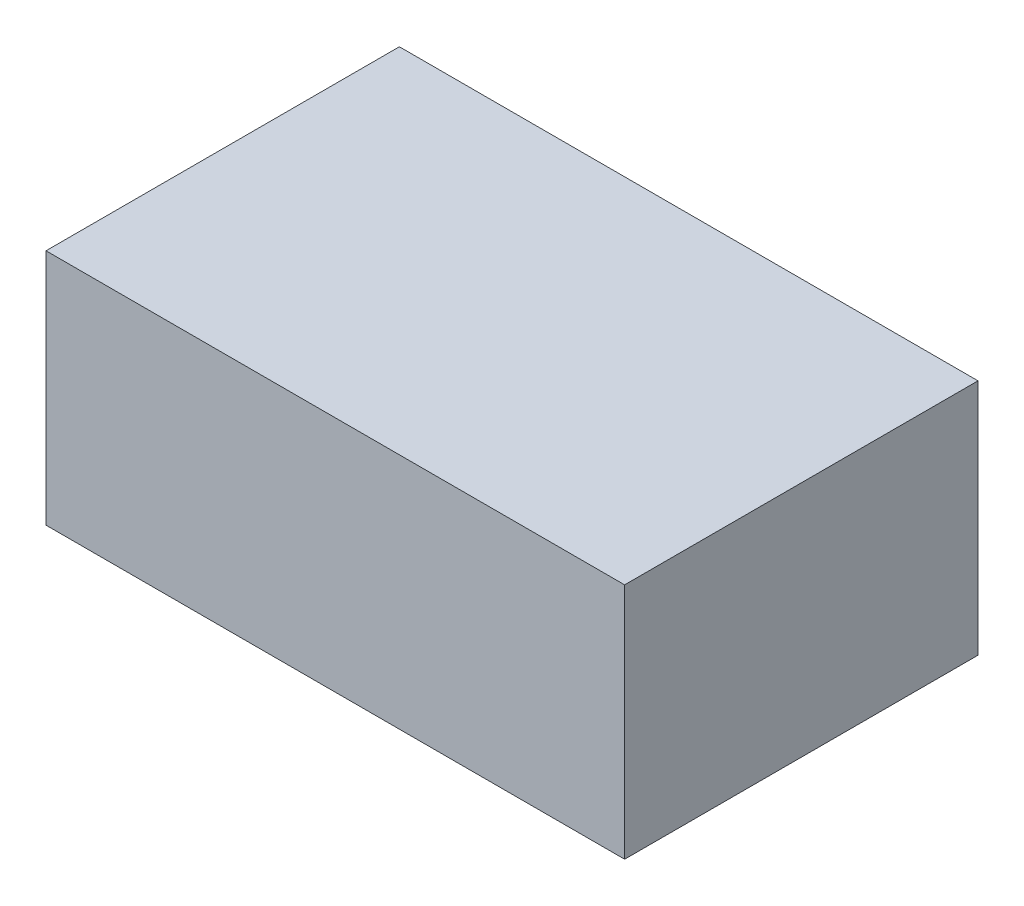
ISO-10303-21;
HEADER;
FILE_DESCRIPTION(('STEP AP214'),'2;1');
FILE_NAME('part.step','',(''),(''),'','','');
FILE_SCHEMA(('AUTOMOTIVE_DESIGN { 1 0 10303 214 1 1 1 1 }'));
ENDSEC;
DATA;
#1=APPLICATION_CONTEXT('core data for automotive mechanical design processes');
#2=APPLICATION_PROTOCOL_DEFINITION('international standard','automotive_design',2000,#1);
#3=PRODUCT_CONTEXT('',#1,'mechanical');
#4=PRODUCT('Part','Part','',(#3));
#5=PRODUCT_RELATED_PRODUCT_CATEGORY('part','',(#4));
#6=PRODUCT_DEFINITION_FORMATION('','',#4);
#7=PRODUCT_DEFINITION_CONTEXT('part definition',#1,'design');
#8=PRODUCT_DEFINITION('design','',#6,#7);
#9=PRODUCT_DEFINITION_SHAPE('','',#8);
#10=(LENGTH_UNIT() NAMED_UNIT(*) SI_UNIT(.MILLI.,.METRE.));
#11=(NAMED_UNIT(*) PLANE_ANGLE_UNIT() SI_UNIT($,.RADIAN.));
#12=(NAMED_UNIT(*) SI_UNIT($,.STERADIAN.) SOLID_ANGLE_UNIT());
#13=UNCERTAINTY_MEASURE_WITH_UNIT(LENGTH_MEASURE(1.E-05),#10,'distance_accuracy_value','');
#14=(GEOMETRIC_REPRESENTATION_CONTEXT(3) GLOBAL_UNCERTAINTY_ASSIGNED_CONTEXT((#13)) GLOBAL_UNIT_ASSIGNED_CONTEXT((#10,
#11,#12)) REPRESENTATION_CONTEXT('',''));
#15=CARTESIAN_POINT('',(0.,0.,0.));
#16=DIRECTION('',(0.,0.,1.));
#17=DIRECTION('',(1.,0.,0.));
#18=AXIS2_PLACEMENT_3D('',#15,#16,#17);
#19=CARTESIAN_POINT('',(-0.05,0.22,-1.89478486941322));
#20=DIRECTION('',(0.,1.,0.));
#21=DIRECTION('',(-1.,0.,0.));
#22=AXIS2_PLACEMENT_3D('',#19,#20,#21);
#23=PLANE('',#22);
#24=DIRECTION('',(1.,0.,0.));
#25=VECTOR('',#24,1.);
#26=CARTESIAN_POINT('',(-0.05,0.22,-0.684));
#27=LINE('',#26,#25);
#28=CARTESIAN_POINT('',(-1.17,0.22,-0.684));
#29=VERTEX_POINT('',#28);
#30=CARTESIAN_POINT('',(-0.05,0.22,-0.684));
#31=VERTEX_POINT('',#30);
#32=EDGE_CURVE('E96',#29,#31,#27,.T.);
#33=ORIENTED_EDGE('',*,*,#32,.F.);
#34=DIRECTION('',(0.,0.,1.));
#35=VECTOR('',#34,1.);
#36=CARTESIAN_POINT('',(-1.17,0.22,-1.89478486941322));
#37=LINE('',#36,#35);
#38=CARTESIAN_POINT('',(-1.17,0.22,0.));
#39=VERTEX_POINT('',#38);
#40=EDGE_CURVE('E37',#29,#39,#37,.T.);
#41=ORIENTED_EDGE('',*,*,#40,.T.);
#42=DIRECTION('',(-1.,0.,0.));
#43=VECTOR('',#42,1.);
#44=CARTESIAN_POINT('',(-0.05,0.22,0.));
#45=LINE('',#44,#43);
#46=CARTESIAN_POINT('',(-0.05,0.22,0.));
#47=VERTEX_POINT('',#46);
#48=EDGE_CURVE('E102',#47,#39,#45,.T.);
#49=ORIENTED_EDGE('',*,*,#48,.F.);
#50=DIRECTION('',(0.,0.,1.));
#51=VECTOR('',#50,1.);
#52=CARTESIAN_POINT('',(-0.05,0.22,-1.89478486941322));
#53=LINE('',#52,#51);
#54=EDGE_CURVE('E95',#31,#47,#53,.T.);
#55=ORIENTED_EDGE('',*,*,#54,.F.);
#56=EDGE_LOOP('',(#33,#41,#49,#55));
#57=FACE_BOUND('',#56,.T.);
#58=ADVANCED_FACE('F33',(#57),#23,.T.);
#59=CARTESIAN_POINT('',(-0.05,-0.24,-1.89478486941322));
#60=DIRECTION('',(1.,0.,0.));
#61=DIRECTION('',(0.,0.,-1.));
#62=AXIS2_PLACEMENT_3D('',#59,#60,#61);
#63=PLANE('',#62);
#64=DIRECTION('',(0.,-1.,0.));
#65=VECTOR('',#64,1.);
#66=CARTESIAN_POINT('',(-0.05,-0.24,-0.684));
#67=LINE('',#66,#65);
#68=CARTESIAN_POINT('',(-0.05,-0.24,-0.684));
#69=VERTEX_POINT('',#68);
#70=EDGE_CURVE('E42',#31,#69,#67,.T.);
#71=ORIENTED_EDGE('',*,*,#70,.F.);
#72=ORIENTED_EDGE('',*,*,#54,.T.);
#73=DIRECTION('',(0.,1.,0.));
#74=VECTOR('',#73,1.);
#75=CARTESIAN_POINT('',(-0.05,-0.24,0.));
#76=LINE('',#75,#74);
#77=CARTESIAN_POINT('',(-0.05,-0.24,0.));
#78=VERTEX_POINT('',#77);
#79=EDGE_CURVE('E91',#78,#47,#76,.T.);
#80=ORIENTED_EDGE('',*,*,#79,.F.);
#81=DIRECTION('',(0.,0.,1.));
#82=VECTOR('',#81,1.);
#83=CARTESIAN_POINT('',(-0.05,-0.24,-1.89478486941322));
#84=LINE('',#83,#82);
#85=EDGE_CURVE('E80',#69,#78,#84,.T.);
#86=ORIENTED_EDGE('',*,*,#85,.F.);
#87=EDGE_LOOP('',(#71,#72,#80,#86));
#88=FACE_BOUND('',#87,.T.);
#89=ADVANCED_FACE('F94',(#88),#63,.T.);
#90=CARTESIAN_POINT('',(-1.17,-0.24,-1.89478486941322));
#91=DIRECTION('',(0.,-1.,0.));
#92=DIRECTION('',(0.,0.,-1.));
#93=AXIS2_PLACEMENT_3D('',#90,#91,#92);
#94=PLANE('',#93);
#95=DIRECTION('',(1.,0.,0.));
#96=VECTOR('',#95,1.);
#97=CARTESIAN_POINT('',(-1.22,-0.24,-0.684));
#98=LINE('',#97,#96);
#99=CARTESIAN_POINT('',(-1.17,-0.24,-0.684));
#100=VERTEX_POINT('',#99);
#101=EDGE_CURVE('E79',#100,#69,#98,.T.);
#102=ORIENTED_EDGE('',*,*,#101,.T.);
#103=ORIENTED_EDGE('',*,*,#85,.T.);
#104=DIRECTION('',(1.,0.,0.));
#105=VECTOR('',#104,1.);
#106=CARTESIAN_POINT('',(-1.17,-0.24,0.));
#107=LINE('',#106,#105);
#108=CARTESIAN_POINT('',(-1.17,-0.24,0.));
#109=VERTEX_POINT('',#108);
#110=EDGE_CURVE('E83',#109,#78,#107,.T.);
#111=ORIENTED_EDGE('',*,*,#110,.F.);
#112=DIRECTION('',(0.,0.,1.));
#113=VECTOR('',#112,1.);
#114=CARTESIAN_POINT('',(-1.17,-0.24,-1.89478486941322));
#115=LINE('',#114,#113);
#116=EDGE_CURVE('E55',#100,#109,#115,.T.);
#117=ORIENTED_EDGE('',*,*,#116,.F.);
#118=EDGE_LOOP('',(#102,#103,#111,#117));
#119=FACE_BOUND('',#118,.T.);
#120=ADVANCED_FACE('F82',(#119),#94,.T.);
#121=CARTESIAN_POINT('',(-1.17,0.22,-1.89478486941322));
#122=DIRECTION('',(-1.,0.,0.));
#123=DIRECTION('',(0.,0.,1.));
#124=AXIS2_PLACEMENT_3D('',#121,#122,#123);
#125=PLANE('',#124);
#126=DIRECTION('',(0.,1.,0.));
#127=VECTOR('',#126,1.);
#128=CARTESIAN_POINT('',(-1.17,0.22,-0.684));
#129=LINE('',#128,#127);
#130=EDGE_CURVE('E11',#100,#29,#129,.T.);
#131=ORIENTED_EDGE('',*,*,#130,.F.);
#132=ORIENTED_EDGE('',*,*,#116,.T.);
#133=DIRECTION('',(0.,-1.,0.));
#134=VECTOR('',#133,1.);
#135=CARTESIAN_POINT('',(-1.17,0.22,0.));
#136=LINE('',#135,#134);
#137=EDGE_CURVE('E92',#39,#109,#136,.T.);
#138=ORIENTED_EDGE('',*,*,#137,.F.);
#139=ORIENTED_EDGE('',*,*,#40,.F.);
#140=EDGE_LOOP('',(#131,#132,#138,#139));
#141=FACE_BOUND('',#140,.T.);
#142=ADVANCED_FACE('F115',(#141),#125,.T.);
#143=CARTESIAN_POINT('',(0.,0.,0.));
#144=DIRECTION('',(0.,0.,1.));
#145=DIRECTION('',(1.,0.,0.));
#146=AXIS2_PLACEMENT_3D('',#143,#144,#145);
#147=PLANE('',#146);
#148=ORIENTED_EDGE('',*,*,#48,.T.);
#149=ORIENTED_EDGE('',*,*,#137,.T.);
#150=ORIENTED_EDGE('',*,*,#110,.T.);
#151=ORIENTED_EDGE('',*,*,#79,.T.);
#152=EDGE_LOOP('',(#148,#149,#150,#151));
#153=FACE_BOUND('',#152,.T.);
#154=ADVANCED_FACE('F90',(#153),#147,.T.);
#155=CARTESIAN_POINT('',(-0.03,-0.22,-0.684));
#156=DIRECTION('',(0.,0.,1.));
#157=DIRECTION('',(0.,1.,0.));
#158=AXIS2_PLACEMENT_3D('',#155,#156,#157);
#159=PLANE('',#158);
#160=ORIENTED_EDGE('',*,*,#32,.T.);
#161=ORIENTED_EDGE('',*,*,#70,.T.);
#162=ORIENTED_EDGE('',*,*,#101,.F.);
#163=ORIENTED_EDGE('',*,*,#130,.T.);
#164=EDGE_LOOP('',(#160,#161,#162,#163));
#165=FACE_BOUND('',#164,.T.);
#166=ADVANCED_FACE('F35',(#165),#159,.F.);
#167=CLOSED_SHELL('',(#58,#89,#120,#142,#154,#166));
#168=MANIFOLD_SOLID_BREP('B2',#167);
#169=ADVANCED_BREP_SHAPE_REPRESENTATION('',(#18,#168),#14);
#170=SHAPE_DEFINITION_REPRESENTATION(#9,#169);
ENDSEC;
END-ISO-10303-21;
